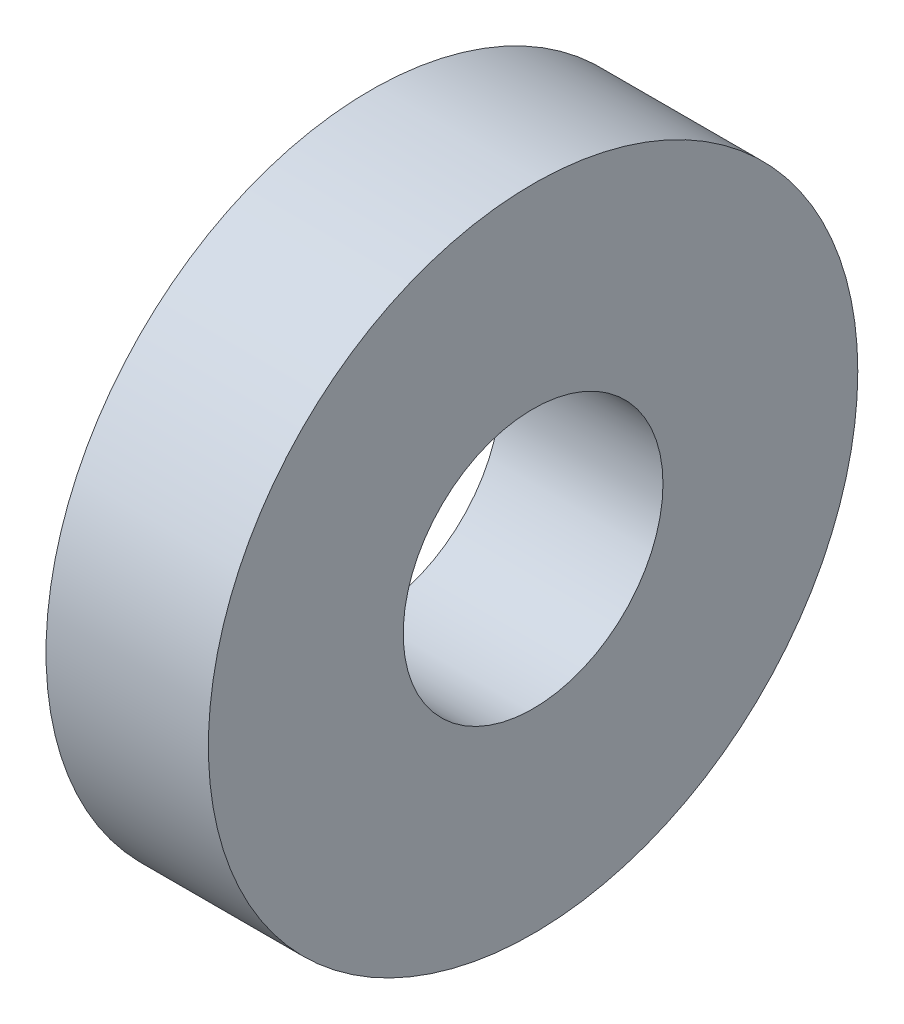
ISO-10303-21;
HEADER;
FILE_DESCRIPTION(('STEP AP214'),'2;1');
FILE_NAME('part.step','',(''),(''),'','','');
FILE_SCHEMA(('AUTOMOTIVE_DESIGN { 1 0 10303 214 1 1 1 1 }'));
ENDSEC;
DATA;
#1=APPLICATION_CONTEXT('core data for automotive mechanical design processes');
#2=APPLICATION_PROTOCOL_DEFINITION('international standard','automotive_design',2000,#1);
#3=PRODUCT_CONTEXT('',#1,'mechanical');
#4=PRODUCT('Part','Part','',(#3));
#5=PRODUCT_RELATED_PRODUCT_CATEGORY('part','',(#4));
#6=PRODUCT_DEFINITION_FORMATION('','',#4);
#7=PRODUCT_DEFINITION_CONTEXT('part definition',#1,'design');
#8=PRODUCT_DEFINITION('design','',#6,#7);
#9=PRODUCT_DEFINITION_SHAPE('','',#8);
#10=(LENGTH_UNIT() NAMED_UNIT(*) SI_UNIT(.MILLI.,.METRE.));
#11=(NAMED_UNIT(*) PLANE_ANGLE_UNIT() SI_UNIT($,.RADIAN.));
#12=(NAMED_UNIT(*) SI_UNIT($,.STERADIAN.) SOLID_ANGLE_UNIT());
#13=UNCERTAINTY_MEASURE_WITH_UNIT(LENGTH_MEASURE(1.E-05),#10,'distance_accuracy_value','');
#14=(GEOMETRIC_REPRESENTATION_CONTEXT(3) GLOBAL_UNCERTAINTY_ASSIGNED_CONTEXT((#13)) GLOBAL_UNIT_ASSIGNED_CONTEXT((#10,
#11,#12)) REPRESENTATION_CONTEXT('',''));
#15=CARTESIAN_POINT('',(0.,0.,0.));
#16=DIRECTION('',(0.,0.,1.));
#17=DIRECTION('',(1.,0.,0.));
#18=AXIS2_PLACEMENT_3D('',#15,#16,#17);
#19=CARTESIAN_POINT('',(5.,0.,0.));
#20=DIRECTION('',(1.,0.,0.));
#21=DIRECTION('',(0.,0.,-1.));
#22=AXIS2_PLACEMENT_3D('',#19,#20,#21);
#23=PLANE('',#22);
#24=CARTESIAN_POINT('',(5.,0.,0.));
#25=DIRECTION('',(1.,0.,0.));
#26=DIRECTION('',(0.,0.,-1.));
#27=AXIS2_PLACEMENT_3D('',#24,#25,#26);
#28=CIRCLE('',#27,10.);
#29=CARTESIAN_POINT('',(5.,0.,-10.));
#30=VERTEX_POINT('',#29);
#31=EDGE_CURVE('E10',#30,#30,#28,.T.);
#32=ORIENTED_EDGE('',*,*,#31,.T.);
#33=EDGE_LOOP('',(#32));
#34=FACE_BOUND('',#33,.T.);
#35=CARTESIAN_POINT('',(5.,0.,0.));
#36=DIRECTION('',(1.,0.,0.));
#37=DIRECTION('',(0.,0.,-1.));
#38=AXIS2_PLACEMENT_3D('',#35,#36,#37);
#39=CIRCLE('',#38,4.);
#40=CARTESIAN_POINT('',(5.,0.,-4.));
#41=VERTEX_POINT('',#40);
#42=EDGE_CURVE('E41',#41,#41,#39,.T.);
#43=ORIENTED_EDGE('',*,*,#42,.F.);
#44=EDGE_LOOP('',(#43));
#45=FACE_BOUND('',#44,.T.);
#46=ADVANCED_FACE('F30',(#34,#45),#23,.T.);
#47=CARTESIAN_POINT('',(0.,0.,0.));
#48=DIRECTION('',(1.,0.,0.));
#49=DIRECTION('',(0.,0.,-1.));
#50=AXIS2_PLACEMENT_3D('',#47,#48,#49);
#51=PLANE('',#50);
#52=CARTESIAN_POINT('',(0.,0.,0.));
#53=DIRECTION('',(1.,0.,0.));
#54=DIRECTION('',(0.,0.,-1.));
#55=AXIS2_PLACEMENT_3D('',#52,#53,#54);
#56=CIRCLE('',#55,10.);
#57=CARTESIAN_POINT('',(0.,0.,-10.));
#58=VERTEX_POINT('',#57);
#59=EDGE_CURVE('E34',#58,#58,#56,.T.);
#60=ORIENTED_EDGE('',*,*,#59,.F.);
#61=EDGE_LOOP('',(#60));
#62=FACE_BOUND('',#61,.T.);
#63=CARTESIAN_POINT('',(0.,0.,0.));
#64=DIRECTION('',(1.,0.,0.));
#65=DIRECTION('',(0.,0.,-1.));
#66=AXIS2_PLACEMENT_3D('',#63,#64,#65);
#67=CIRCLE('',#66,4.);
#68=CARTESIAN_POINT('',(0.,0.,-4.));
#69=VERTEX_POINT('',#68);
#70=EDGE_CURVE('E43',#69,#69,#67,.T.);
#71=ORIENTED_EDGE('',*,*,#70,.T.);
#72=EDGE_LOOP('',(#71));
#73=FACE_BOUND('',#72,.T.);
#74=ADVANCED_FACE('F53',(#62,#73),#51,.F.);
#75=CARTESIAN_POINT('',(5.,0.,0.));
#76=DIRECTION('',(-1.,0.,0.));
#77=DIRECTION('',(0.,0.,1.));
#78=AXIS2_PLACEMENT_3D('',#75,#76,#77);
#79=CYLINDRICAL_SURFACE('',#78,10.);
#80=ORIENTED_EDGE('',*,*,#31,.F.);
#81=EDGE_LOOP('',(#80));
#82=FACE_BOUND('',#81,.T.);
#83=ORIENTED_EDGE('',*,*,#59,.T.);
#84=EDGE_LOOP('',(#83));
#85=FACE_BOUND('',#84,.T.);
#86=ADVANCED_FACE('F32',(#82,#85),#79,.T.);
#87=CARTESIAN_POINT('',(5.,0.,0.));
#88=DIRECTION('',(-1.,0.,0.));
#89=DIRECTION('',(0.,0.,1.));
#90=AXIS2_PLACEMENT_3D('',#87,#88,#89);
#91=CYLINDRICAL_SURFACE('',#90,4.);
#92=ORIENTED_EDGE('',*,*,#42,.T.);
#93=EDGE_LOOP('',(#92));
#94=FACE_BOUND('',#93,.T.);
#95=ORIENTED_EDGE('',*,*,#70,.F.);
#96=EDGE_LOOP('',(#95));
#97=FACE_BOUND('',#96,.T.);
#98=ADVANCED_FACE('F49',(#94,#97),#91,.F.);
#99=CLOSED_SHELL('',(#46,#74,#86,#98));
#100=MANIFOLD_SOLID_BREP('B2',#99);
#101=ADVANCED_BREP_SHAPE_REPRESENTATION('',(#18,#100),#14);
#102=SHAPE_DEFINITION_REPRESENTATION(#9,#101);
ENDSEC;
END-ISO-10303-21;
